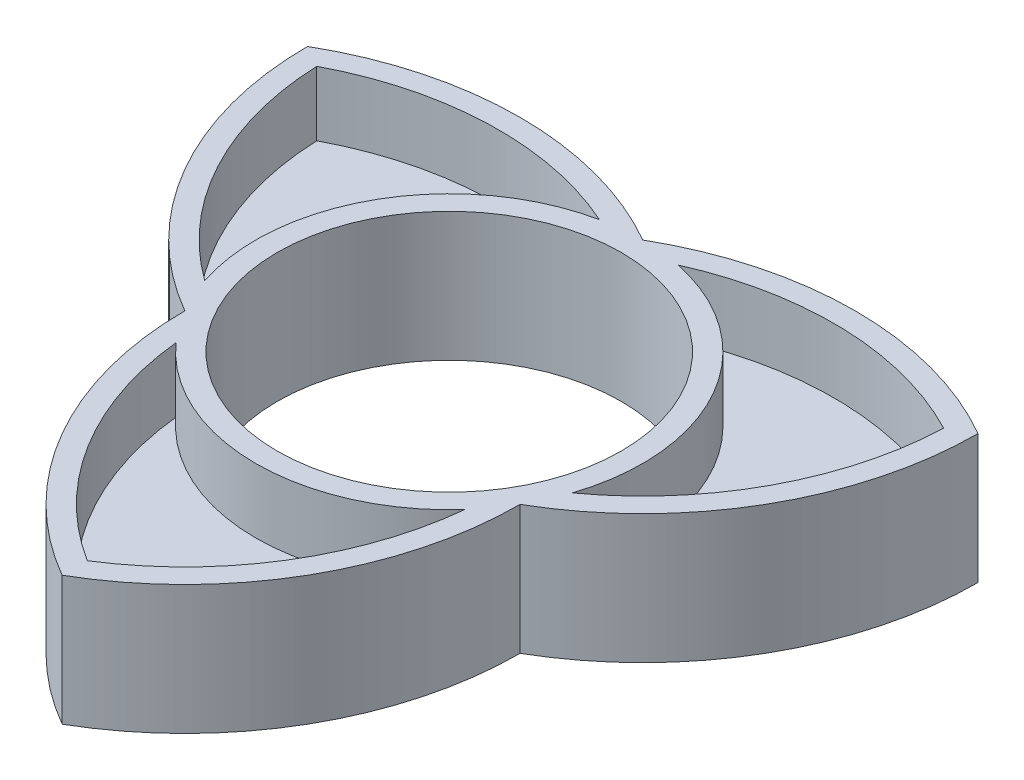
ISO-10303-21;
HEADER;
FILE_DESCRIPTION(('STEP AP214'),'2;1');
FILE_NAME('part.step','',(''),(''),'','','');
FILE_SCHEMA(('AUTOMOTIVE_DESIGN { 1 0 10303 214 1 1 1 1 }'));
ENDSEC;
DATA;
#1=APPLICATION_CONTEXT('core data for automotive mechanical design processes');
#2=APPLICATION_PROTOCOL_DEFINITION('international standard','automotive_design',2000,#1);
#3=PRODUCT_CONTEXT('',#1,'mechanical');
#4=PRODUCT('Part','Part','',(#3));
#5=PRODUCT_RELATED_PRODUCT_CATEGORY('part','',(#4));
#6=PRODUCT_DEFINITION_FORMATION('','',#4);
#7=PRODUCT_DEFINITION_CONTEXT('part definition',#1,'design');
#8=PRODUCT_DEFINITION('design','',#6,#7);
#9=PRODUCT_DEFINITION_SHAPE('','',#8);
#10=(LENGTH_UNIT() NAMED_UNIT(*) SI_UNIT(.MILLI.,.METRE.));
#11=(NAMED_UNIT(*) PLANE_ANGLE_UNIT() SI_UNIT($,.RADIAN.));
#12=(NAMED_UNIT(*) SI_UNIT($,.STERADIAN.) SOLID_ANGLE_UNIT());
#13=UNCERTAINTY_MEASURE_WITH_UNIT(LENGTH_MEASURE(1.E-05),#10,'distance_accuracy_value','');
#14=(GEOMETRIC_REPRESENTATION_CONTEXT(3) GLOBAL_UNCERTAINTY_ASSIGNED_CONTEXT((#13)) GLOBAL_UNIT_ASSIGNED_CONTEXT((#10,
#11,#12)) REPRESENTATION_CONTEXT('',''));
#15=CARTESIAN_POINT('',(0.,0.,0.));
#16=DIRECTION('',(0.,0.,1.));
#17=DIRECTION('',(1.,0.,0.));
#18=AXIS2_PLACEMENT_3D('',#15,#16,#17);
#19=CARTESIAN_POINT('',(-49.6410161513769,-0.01,-37.6602540378446));
#20=DIRECTION('',(0.,1.,0.));
#21=DIRECTION('',(0.,0.,1.));
#22=AXIS2_PLACEMENT_3D('',#19,#20,#21);
#23=CYLINDRICAL_SURFACE('',#22,15.5884572681199);
#24=CARTESIAN_POINT('',(-49.6410161513769,0.,-37.6602540378446));
#25=DIRECTION('',(0.,1.,0.));
#26=DIRECTION('',(0.,0.,1.));
#27=AXIS2_PLACEMENT_3D('',#24,#25,#26);
#28=CIRCLE('',#27,15.5884572681198);
#29=CARTESIAN_POINT('',(-41.8467875173167,0.,-24.1602540378449));
#30=VERTEX_POINT('',#29);
#31=CARTESIAN_POINT('',(-34.052558883257,0.,-37.6602540378446));
#32=VERTEX_POINT('',#31);
#33=EDGE_CURVE('E164',#30,#32,#28,.T.);
#34=ORIENTED_EDGE('',*,*,#33,.T.);
#35=DIRECTION('',(0.,1.,0.));
#36=VECTOR('',#35,1.);
#37=CARTESIAN_POINT('',(-34.0525588832569,-0.01,-37.6602540378446));
#38=LINE('',#37,#36);
#39=CARTESIAN_POINT('',(-34.0525588832569,6.,-37.6602540378446));
#40=VERTEX_POINT('',#39);
#41=EDGE_CURVE('E11',#32,#40,#38,.T.);
#42=ORIENTED_EDGE('',*,*,#41,.T.);
#43=CARTESIAN_POINT('',(-49.6410161513769,6.,-37.6602540378446));
#44=DIRECTION('',(0.,1.,0.));
#45=DIRECTION('',(0.,0.,1.));
#46=AXIS2_PLACEMENT_3D('',#43,#44,#45);
#47=CIRCLE('',#46,15.5884572681198);
#48=CARTESIAN_POINT('',(-41.8467875173169,6.,-24.1602540378451));
#49=VERTEX_POINT('',#48);
#50=EDGE_CURVE('E187',#49,#40,#47,.T.);
#51=ORIENTED_EDGE('',*,*,#50,.F.);
#52=DIRECTION('',(0.,-1.,0.));
#53=VECTOR('',#52,1.);
#54=CARTESIAN_POINT('',(-41.8467875173167,3.,-24.1602540378449));
#55=LINE('',#54,#53);
#56=EDGE_CURVE('E177',#49,#30,#55,.T.);
#57=ORIENTED_EDGE('',*,*,#56,.T.);
#58=EDGE_LOOP('',(#34,#42,#51,#57));
#59=FACE_BOUND('',#58,.T.);
#60=ADVANCED_FACE('F44',(#59),#23,.T.);
#61=CARTESIAN_POINT('',(-41.8467875173169,-0.01,-24.1602540378451));
#62=DIRECTION('',(0.,1.,0.));
#63=DIRECTION('',(0.,0.,1.));
#64=AXIS2_PLACEMENT_3D('',#61,#62,#63);
#65=CYLINDRICAL_SURFACE('',#64,15.5884572681195);
#66=ORIENTED_EDGE('',*,*,#41,.F.);
#67=CARTESIAN_POINT('',(-41.8467875173169,0.,-24.1602540378451));
#68=DIRECTION('',(0.,1.,0.));
#69=DIRECTION('',(0.,0.,1.));
#70=AXIS2_PLACEMENT_3D('',#67,#68,#69);
#71=CIRCLE('',#70,15.5884572681195);
#72=CARTESIAN_POINT('',(-49.6410161513769,0.,-37.6602540378446));
#73=VERTEX_POINT('',#72);
#74=EDGE_CURVE('E161',#73,#32,#71,.F.);
#75=ORIENTED_EDGE('',*,*,#74,.F.);
#76=DIRECTION('',(0.,-1.,0.));
#77=VECTOR('',#76,1.);
#78=CARTESIAN_POINT('',(-49.6410161513769,3.,-37.6602540378446));
#79=LINE('',#78,#77);
#80=CARTESIAN_POINT('',(-49.6410161513769,6.,-37.6602540378447));
#81=VERTEX_POINT('',#80);
#82=EDGE_CURVE('E183',#81,#73,#79,.T.);
#83=ORIENTED_EDGE('',*,*,#82,.F.);
#84=CARTESIAN_POINT('',(-41.8467875173169,6.,-24.1602540378451));
#85=DIRECTION('',(0.,1.,0.));
#86=DIRECTION('',(0.,0.,1.));
#87=AXIS2_PLACEMENT_3D('',#84,#85,#86);
#88=CIRCLE('',#87,15.5884572681195);
#89=EDGE_CURVE('E182',#40,#81,#88,.T.);
#90=ORIENTED_EDGE('',*,*,#89,.F.);
#91=EDGE_LOOP('',(#66,#75,#83,#90));
#92=FACE_BOUND('',#91,.T.);
#93=ADVANCED_FACE('F181',(#92),#65,.T.);
#94=CARTESIAN_POINT('',(0.,3.,0.));
#95=DIRECTION('',(0.,1.,0.));
#96=DIRECTION('',(0.,0.,1.));
#97=AXIS2_PLACEMENT_3D('',#94,#95,#96);
#98=PLANE('',#97);
#99=CARTESIAN_POINT('',(-41.8467875173169,3.,-24.1602540378451));
#100=DIRECTION('',(0.,1.,0.));
#101=DIRECTION('',(0.,0.,1.));
#102=AXIS2_PLACEMENT_3D('',#99,#100,#101);
#103=CIRCLE('',#102,14.5884572681202);
#104=CARTESIAN_POINT('',(-56.3590588345806,3.,-22.6712722790935));
#105=VERTEX_POINT('',#104);
#106=CARTESIAN_POINT('',(-49.6410161513768,3.,-11.8284623811646));
#107=VERTEX_POINT('',#106);
#108=EDGE_CURVE('E124',#105,#107,#103,.T.);
#109=ORIENTED_EDGE('',*,*,#108,.T.);
#110=CARTESIAN_POINT('',(-57.4352447854369,3.,-24.1602540378445));
#111=DIRECTION('',(0.,1.,0.));
#112=DIRECTION('',(0.,0.,1.));
#113=AXIS2_PLACEMENT_3D('',#110,#111,#112);
#114=CIRCLE('',#113,14.58845726812);
#115=CARTESIAN_POINT('',(-42.9229734681733,3.,-22.6712722790941));
#116=VERTEX_POINT('',#115);
#117=EDGE_CURVE('E217',#107,#116,#114,.T.);
#118=ORIENTED_EDGE('',*,*,#117,.T.);
#119=CARTESIAN_POINT('',(-49.6410161513772,3.,-28.660254037845));
#120=DIRECTION('',(0.,1.,0.));
#121=DIRECTION('',(0.,0.,1.));
#122=AXIS2_PLACEMENT_3D('',#119,#120,#121);
#123=CIRCLE('',#122,9.);
#124=EDGE_CURVE('E226',#105,#116,#123,.T.);
#125=ORIENTED_EDGE('',*,*,#124,.F.);
#126=EDGE_LOOP('',(#109,#118,#125));
#127=FACE_BOUND('',#126,.T.);
#128=ADVANCED_FACE('F325',(#127),#98,.T.);
#129=CARTESIAN_POINT('',(-57.4352447854369,3.,-24.1602540378445));
#130=DIRECTION('',(0.,1.,0.));
#131=DIRECTION('',(0.,0.,1.));
#132=AXIS2_PLACEMENT_3D('',#129,#130,#131);
#133=CIRCLE('',#132,14.58845726812);
#134=CARTESIAN_POINT('',(-51.4686051556561,3.,-37.4727405445829));
#135=VERTEX_POINT('',#134);
#136=CARTESIAN_POINT('',(-64.2177753172688,3.,-37.0761498661846));
#137=VERTEX_POINT('',#136);
#138=EDGE_CURVE('E288',#135,#137,#133,.T.);
#139=ORIENTED_EDGE('',*,*,#138,.T.);
#140=CARTESIAN_POINT('',(-49.6410161513769,3.,-37.6602540378446));
#141=DIRECTION('',(0.,1.,0.));
#142=DIRECTION('',(0.,0.,1.));
#143=AXIS2_PLACEMENT_3D('',#140,#141,#142);
#144=CIRCLE('',#143,14.58845726812);
#145=CARTESIAN_POINT('',(-58.1866478388591,3.,-25.8367492898579));
#146=VERTEX_POINT('',#145);
#147=EDGE_CURVE('E286',#137,#146,#144,.T.);
#148=ORIENTED_EDGE('',*,*,#147,.T.);
#149=EDGE_CURVE('E227',#135,#146,#123,.T.);
#150=ORIENTED_EDGE('',*,*,#149,.F.);
#151=EDGE_LOOP('',(#139,#148,#150));
#152=FACE_BOUND('',#151,.T.);
#153=ADVANCED_FACE('F324',(#152),#98,.T.);
#154=CARTESIAN_POINT('',(-49.6410161513769,3.,-37.6602540378446));
#155=DIRECTION('',(0.,1.,0.));
#156=DIRECTION('',(0.,0.,1.));
#157=AXIS2_PLACEMENT_3D('',#154,#155,#156);
#158=CIRCLE('',#157,14.5884572681198);
#159=CARTESIAN_POINT('',(-41.0953844638954,3.,-25.8367492898577));
#160=VERTEX_POINT('',#159);
#161=CARTESIAN_POINT('',(-35.0642569854851,3.,-37.0761498661846));
#162=VERTEX_POINT('',#161);
#163=EDGE_CURVE('E61',#160,#162,#158,.T.);
#164=ORIENTED_EDGE('',*,*,#163,.T.);
#165=CARTESIAN_POINT('',(-41.8467875173169,3.,-24.1602540378451));
#166=DIRECTION('',(0.,1.,0.));
#167=DIRECTION('',(0.,0.,1.));
#168=AXIS2_PLACEMENT_3D('',#165,#166,#167);
#169=CIRCLE('',#168,14.5884572681195);
#170=CARTESIAN_POINT('',(-47.8134271470979,3.,-37.4727405445829));
#171=VERTEX_POINT('',#170);
#172=EDGE_CURVE('E224',#162,#171,#169,.T.);
#173=ORIENTED_EDGE('',*,*,#172,.T.);
#174=EDGE_CURVE('E221',#160,#171,#123,.T.);
#175=ORIENTED_EDGE('',*,*,#174,.F.);
#176=EDGE_LOOP('',(#164,#173,#175));
#177=FACE_BOUND('',#176,.T.);
#178=ADVANCED_FACE('F290',(#177),#98,.T.);
#179=CARTESIAN_POINT('',(-49.6410161513772,6.,-28.660254037845));
#180=DIRECTION('',(0.,-1.,0.));
#181=DIRECTION('',(0.,0.,-1.));
#182=AXIS2_PLACEMENT_3D('',#179,#180,#181);
#183=CYLINDRICAL_SURFACE('',#182,8.);
#184=CARTESIAN_POINT('',(-49.6410161513772,6.,-28.660254037845));
#185=DIRECTION('',(0.,1.,0.));
#186=DIRECTION('',(0.,0.,1.));
#187=AXIS2_PLACEMENT_3D('',#184,#185,#186);
#188=CIRCLE('',#187,8.);
#189=CARTESIAN_POINT('',(-49.6410161513772,6.,-20.660254037845));
#190=VERTEX_POINT('',#189);
#191=EDGE_CURVE('E230',#190,#190,#188,.T.);
#192=ORIENTED_EDGE('',*,*,#191,.T.);
#193=EDGE_LOOP('',(#192));
#194=FACE_BOUND('',#193,.T.);
#195=CARTESIAN_POINT('',(-49.6410161513772,0.,-28.660254037845));
#196=DIRECTION('',(0.,1.,0.));
#197=DIRECTION('',(0.,0.,1.));
#198=AXIS2_PLACEMENT_3D('',#195,#196,#197);
#199=CIRCLE('',#198,8.);
#200=CARTESIAN_POINT('',(-49.6410161513772,0.,-20.660254037845));
#201=VERTEX_POINT('',#200);
#202=EDGE_CURVE('E53',#201,#201,#199,.T.);
#203=ORIENTED_EDGE('',*,*,#202,.F.);
#204=EDGE_LOOP('',(#203));
#205=FACE_BOUND('',#204,.T.);
#206=ADVANCED_FACE('F346',(#194,#205),#183,.F.);
#207=CARTESIAN_POINT('',(-41.8467875173169,3.,-24.1602540378451));
#208=DIRECTION('',(0.,-1.,0.));
#209=DIRECTION('',(0.,0.,-1.));
#210=AXIS2_PLACEMENT_3D('',#207,#208,#209);
#211=CYLINDRICAL_SURFACE('',#210,15.5884572681204);
#212=CARTESIAN_POINT('',(-41.8467875173169,0.,-24.1602540378451));
#213=DIRECTION('',(0.,1.,0.));
#214=DIRECTION('',(0.,0.,1.));
#215=AXIS2_PLACEMENT_3D('',#212,#213,#214);
#216=CIRCLE('',#215,15.5884572681204);
#217=CARTESIAN_POINT('',(-49.6410161513769,0.,-10.6602540378444));
#218=VERTEX_POINT('',#217);
#219=CARTESIAN_POINT('',(-57.4352447854369,0.,-24.1602540378445));
#220=VERTEX_POINT('',#219);
#221=EDGE_CURVE('E250',#218,#220,#216,.F.);
#222=ORIENTED_EDGE('',*,*,#221,.F.);
#223=DIRECTION('',(0.,-1.,0.));
#224=VECTOR('',#223,1.);
#225=CARTESIAN_POINT('',(-49.6410161513769,3.,-10.6602540378444));
#226=LINE('',#225,#224);
#227=CARTESIAN_POINT('',(-49.6410161513769,6.,-10.6602540378444));
#228=VERTEX_POINT('',#227);
#229=EDGE_CURVE('E248',#228,#218,#226,.T.);
#230=ORIENTED_EDGE('',*,*,#229,.F.);
#231=CARTESIAN_POINT('',(-41.8467875173169,6.,-24.1602540378451));
#232=DIRECTION('',(0.,1.,0.));
#233=DIRECTION('',(0.,0.,1.));
#234=AXIS2_PLACEMENT_3D('',#231,#232,#233);
#235=CIRCLE('',#234,15.5884572681202);
#236=CARTESIAN_POINT('',(-57.4352447854371,6.,-24.1602540378445));
#237=VERTEX_POINT('',#236);
#238=EDGE_CURVE('E233',#237,#228,#235,.T.);
#239=ORIENTED_EDGE('',*,*,#238,.F.);
#240=DIRECTION('',(0.,-1.,0.));
#241=VECTOR('',#240,1.);
#242=CARTESIAN_POINT('',(-57.4352447854369,3.,-24.1602540378445));
#243=LINE('',#242,#241);
#244=EDGE_CURVE('E246',#237,#220,#243,.T.);
#245=ORIENTED_EDGE('',*,*,#244,.T.);
#246=EDGE_LOOP('',(#222,#230,#239,#245));
#247=FACE_BOUND('',#246,.T.);
#248=ADVANCED_FACE('F245',(#247),#211,.T.);
#249=CARTESIAN_POINT('',(-49.6410161513769,3.,-37.6602540378446));
#250=DIRECTION('',(0.,-1.,0.));
#251=DIRECTION('',(0.,0.,-1.));
#252=AXIS2_PLACEMENT_3D('',#249,#250,#251);
#253=CYLINDRICAL_SURFACE('',#252,15.58845726812);
#254=CARTESIAN_POINT('',(-49.6410161513769,0.,-37.6602540378446));
#255=DIRECTION('',(0.,1.,0.));
#256=DIRECTION('',(0.,0.,1.));
#257=AXIS2_PLACEMENT_3D('',#254,#255,#256);
#258=CIRCLE('',#257,15.58845726812);
#259=CARTESIAN_POINT('',(-65.2294734194969,0.,-37.6602540378446));
#260=VERTEX_POINT('',#259);
#261=EDGE_CURVE('E260',#260,#220,#258,.T.);
#262=ORIENTED_EDGE('',*,*,#261,.T.);
#263=ORIENTED_EDGE('',*,*,#244,.F.);
#264=CARTESIAN_POINT('',(-49.6410161513769,6.,-37.6602540378446));
#265=DIRECTION('',(0.,1.,0.));
#266=DIRECTION('',(0.,0.,1.));
#267=AXIS2_PLACEMENT_3D('',#264,#265,#266);
#268=CIRCLE('',#267,15.58845726812);
#269=CARTESIAN_POINT('',(-65.2294734194969,6.,-37.6602540378446));
#270=VERTEX_POINT('',#269);
#271=EDGE_CURVE('E192',#270,#237,#268,.T.);
#272=ORIENTED_EDGE('',*,*,#271,.F.);
#273=DIRECTION('',(0.,-1.,0.));
#274=VECTOR('',#273,1.);
#275=CARTESIAN_POINT('',(-65.2294734194969,3.,-37.6602540378446));
#276=LINE('',#275,#274);
#277=EDGE_CURVE('E254',#270,#260,#276,.T.);
#278=ORIENTED_EDGE('',*,*,#277,.T.);
#279=EDGE_LOOP('',(#262,#263,#272,#278));
#280=FACE_BOUND('',#279,.T.);
#281=ADVANCED_FACE('F354',(#280),#253,.T.);
#282=CARTESIAN_POINT('',(-57.4352447854369,3.,-24.1602540378445));
#283=DIRECTION('',(0.,-1.,0.));
#284=DIRECTION('',(0.,0.,-1.));
#285=AXIS2_PLACEMENT_3D('',#282,#283,#284);
#286=CYLINDRICAL_SURFACE('',#285,15.58845726812);
#287=CARTESIAN_POINT('',(-57.4352447854369,0.,-24.1602540378445));
#288=DIRECTION('',(0.,1.,0.));
#289=DIRECTION('',(0.,0.,1.));
#290=AXIS2_PLACEMENT_3D('',#287,#288,#289);
#291=CIRCLE('',#290,15.58845726812);
#292=EDGE_CURVE('E168',#260,#73,#291,.F.);
#293=ORIENTED_EDGE('',*,*,#292,.F.);
#294=ORIENTED_EDGE('',*,*,#277,.F.);
#295=CARTESIAN_POINT('',(-57.4352447854369,6.,-24.1602540378445));
#296=DIRECTION('',(0.,1.,0.));
#297=DIRECTION('',(0.,0.,1.));
#298=AXIS2_PLACEMENT_3D('',#295,#296,#297);
#299=CIRCLE('',#298,15.58845726812);
#300=EDGE_CURVE('E188',#81,#270,#299,.T.);
#301=ORIENTED_EDGE('',*,*,#300,.F.);
#302=ORIENTED_EDGE('',*,*,#82,.T.);
#303=EDGE_LOOP('',(#293,#294,#301,#302));
#304=FACE_BOUND('',#303,.T.);
#305=ADVANCED_FACE('F336',(#304),#286,.T.);
#306=CARTESIAN_POINT('',(-57.4352447854369,3.,-24.1602540378445));
#307=DIRECTION('',(0.,-1.,0.));
#308=DIRECTION('',(0.,0.,-1.));
#309=AXIS2_PLACEMENT_3D('',#306,#307,#308);
#310=CYLINDRICAL_SURFACE('',#309,15.58845726812);
#311=CARTESIAN_POINT('',(-57.4352447854369,0.,-24.1602540378445));
#312=DIRECTION('',(0.,1.,0.));
#313=DIRECTION('',(0.,0.,1.));
#314=AXIS2_PLACEMENT_3D('',#311,#312,#313);
#315=CIRCLE('',#314,15.58845726812);
#316=EDGE_CURVE('E178',#30,#218,#315,.F.);
#317=ORIENTED_EDGE('',*,*,#316,.F.);
#318=ORIENTED_EDGE('',*,*,#56,.F.);
#319=CARTESIAN_POINT('',(-57.4352447854369,6.,-24.1602540378445));
#320=DIRECTION('',(0.,1.,0.));
#321=DIRECTION('',(0.,0.,1.));
#322=AXIS2_PLACEMENT_3D('',#319,#320,#321);
#323=CIRCLE('',#322,15.58845726812);
#324=EDGE_CURVE('E190',#228,#49,#323,.T.);
#325=ORIENTED_EDGE('',*,*,#324,.F.);
#326=ORIENTED_EDGE('',*,*,#229,.T.);
#327=EDGE_LOOP('',(#317,#318,#325,#326));
#328=FACE_BOUND('',#327,.T.);
#329=ADVANCED_FACE('F329',(#328),#310,.T.);
#330=CARTESIAN_POINT('',(-57.4352447854369,6.,-24.1602540378445));
#331=DIRECTION('',(0.,-1.,0.));
#332=DIRECTION('',(0.,0.,-1.));
#333=AXIS2_PLACEMENT_3D('',#330,#331,#332);
#334=CYLINDRICAL_SURFACE('',#333,14.58845726812);
#335=ORIENTED_EDGE('',*,*,#117,.F.);
#336=DIRECTION('',(0.,-1.,0.));
#337=VECTOR('',#336,1.);
#338=CARTESIAN_POINT('',(-49.6410161513768,6.,-11.8284623811646));
#339=LINE('',#338,#337);
#340=CARTESIAN_POINT('',(-49.6410161513768,6.,-11.8284623811646));
#341=VERTEX_POINT('',#340);
#342=EDGE_CURVE('E273',#341,#107,#339,.T.);
#343=ORIENTED_EDGE('',*,*,#342,.F.);
#344=CARTESIAN_POINT('',(-57.4352447854369,6.,-24.1602540378445));
#345=DIRECTION('',(0.,1.,0.));
#346=DIRECTION('',(0.,0.,1.));
#347=AXIS2_PLACEMENT_3D('',#344,#345,#346);
#348=CIRCLE('',#347,14.58845726812);
#349=CARTESIAN_POINT('',(-42.9229734681733,6.,-22.6712722790941));
#350=VERTEX_POINT('',#349);
#351=EDGE_CURVE('E198',#341,#350,#348,.T.);
#352=ORIENTED_EDGE('',*,*,#351,.T.);
#353=DIRECTION('',(0.,-1.,0.));
#354=VECTOR('',#353,1.);
#355=CARTESIAN_POINT('',(-42.9229734681733,6.,-22.6712722790941));
#356=LINE('',#355,#354);
#357=EDGE_CURVE('E280',#350,#116,#356,.T.);
#358=ORIENTED_EDGE('',*,*,#357,.T.);
#359=EDGE_LOOP('',(#335,#343,#352,#358));
#360=FACE_BOUND('',#359,.T.);
#361=ADVANCED_FACE('F327',(#360),#334,.F.);
#362=CARTESIAN_POINT('',(-49.6410161513772,6.,-28.660254037845));
#363=DIRECTION('',(0.,-1.,0.));
#364=DIRECTION('',(0.,0.,-1.));
#365=AXIS2_PLACEMENT_3D('',#362,#363,#364);
#366=CYLINDRICAL_SURFACE('',#365,9.);
#367=ORIENTED_EDGE('',*,*,#124,.T.);
#368=ORIENTED_EDGE('',*,*,#357,.F.);
#369=CARTESIAN_POINT('',(-49.6410161513772,6.,-28.660254037845));
#370=DIRECTION('',(0.,1.,0.));
#371=DIRECTION('',(0.,0.,1.));
#372=AXIS2_PLACEMENT_3D('',#369,#370,#371);
#373=CIRCLE('',#372,9.);
#374=CARTESIAN_POINT('',(-56.3590588345806,6.,-22.6712722790935));
#375=VERTEX_POINT('',#374);
#376=EDGE_CURVE('E201',#375,#350,#373,.T.);
#377=ORIENTED_EDGE('',*,*,#376,.F.);
#378=DIRECTION('',(0.,-1.,0.));
#379=VECTOR('',#378,1.);
#380=CARTESIAN_POINT('',(-56.3590588345806,6.,-22.6712722790935));
#381=LINE('',#380,#379);
#382=EDGE_CURVE('E172',#375,#105,#381,.T.);
#383=ORIENTED_EDGE('',*,*,#382,.T.);
#384=EDGE_LOOP('',(#367,#368,#377,#383));
#385=FACE_BOUND('',#384,.T.);
#386=ADVANCED_FACE('F311',(#385),#366,.T.);
#387=CARTESIAN_POINT('',(-41.8467875173169,6.,-24.1602540378451));
#388=DIRECTION('',(0.,-1.,0.));
#389=DIRECTION('',(0.,0.,-1.));
#390=AXIS2_PLACEMENT_3D('',#387,#388,#389);
#391=CYLINDRICAL_SURFACE('',#390,14.5884572681202);
#392=ORIENTED_EDGE('',*,*,#108,.F.);
#393=ORIENTED_EDGE('',*,*,#382,.F.);
#394=CARTESIAN_POINT('',(-41.8467875173169,6.,-24.1602540378451));
#395=DIRECTION('',(0.,1.,0.));
#396=DIRECTION('',(0.,0.,1.));
#397=AXIS2_PLACEMENT_3D('',#394,#395,#396);
#398=CIRCLE('',#397,14.5884572681202);
#399=EDGE_CURVE('E202',#375,#341,#398,.T.);
#400=ORIENTED_EDGE('',*,*,#399,.T.);
#401=ORIENTED_EDGE('',*,*,#342,.T.);
#402=EDGE_LOOP('',(#392,#393,#400,#401));
#403=FACE_BOUND('',#402,.T.);
#404=ADVANCED_FACE('F307',(#403),#391,.F.);
#405=CARTESIAN_POINT('',(-49.6410161513769,6.,-37.6602540378446));
#406=DIRECTION('',(0.,-1.,0.));
#407=DIRECTION('',(0.,0.,-1.));
#408=AXIS2_PLACEMENT_3D('',#405,#406,#407);
#409=CYLINDRICAL_SURFACE('',#408,14.58845726812);
#410=ORIENTED_EDGE('',*,*,#147,.F.);
#411=DIRECTION('',(0.,-1.,0.));
#412=VECTOR('',#411,1.);
#413=CARTESIAN_POINT('',(-64.2177753172688,6.,-37.0761498661846));
#414=LINE('',#413,#412);
#415=CARTESIAN_POINT('',(-64.2177753172688,6.,-37.0761498661846));
#416=VERTEX_POINT('',#415);
#417=EDGE_CURVE('E265',#416,#137,#414,.T.);
#418=ORIENTED_EDGE('',*,*,#417,.F.);
#419=CARTESIAN_POINT('',(-49.6410161513769,6.,-37.6602540378446));
#420=DIRECTION('',(0.,1.,0.));
#421=DIRECTION('',(0.,0.,1.));
#422=AXIS2_PLACEMENT_3D('',#419,#420,#421);
#423=CIRCLE('',#422,14.58845726812);
#424=CARTESIAN_POINT('',(-58.1866478388591,6.,-25.8367492898579));
#425=VERTEX_POINT('',#424);
#426=EDGE_CURVE('E205',#416,#425,#423,.T.);
#427=ORIENTED_EDGE('',*,*,#426,.T.);
#428=DIRECTION('',(0.,-1.,0.));
#429=VECTOR('',#428,1.);
#430=CARTESIAN_POINT('',(-58.1866478388591,6.,-25.8367492898579));
#431=LINE('',#430,#429);
#432=EDGE_CURVE('E272',#425,#146,#431,.T.);
#433=ORIENTED_EDGE('',*,*,#432,.T.);
#434=EDGE_LOOP('',(#410,#418,#427,#433));
#435=FACE_BOUND('',#434,.T.);
#436=ADVANCED_FACE('F319',(#435),#409,.F.);
#437=ORIENTED_EDGE('',*,*,#149,.T.);
#438=ORIENTED_EDGE('',*,*,#432,.F.);
#439=CARTESIAN_POINT('',(-51.4686051556561,6.,-37.4727405445829));
#440=VERTEX_POINT('',#439);
#441=EDGE_CURVE('E208',#440,#425,#373,.T.);
#442=ORIENTED_EDGE('',*,*,#441,.F.);
#443=DIRECTION('',(0.,-1.,0.));
#444=VECTOR('',#443,1.);
#445=CARTESIAN_POINT('',(-51.4686051556561,6.,-37.4727405445829));
#446=LINE('',#445,#444);
#447=EDGE_CURVE('E269',#440,#135,#446,.T.);
#448=ORIENTED_EDGE('',*,*,#447,.T.);
#449=EDGE_LOOP('',(#437,#438,#442,#448));
#450=FACE_BOUND('',#449,.T.);
#451=ADVANCED_FACE('F316',(#450),#366,.T.);
#452=CARTESIAN_POINT('',(-57.4352447854369,6.,-24.1602540378445));
#453=DIRECTION('',(0.,-1.,0.));
#454=DIRECTION('',(0.,0.,-1.));
#455=AXIS2_PLACEMENT_3D('',#452,#453,#454);
#456=CYLINDRICAL_SURFACE('',#455,14.58845726812);
#457=ORIENTED_EDGE('',*,*,#138,.F.);
#458=ORIENTED_EDGE('',*,*,#447,.F.);
#459=CARTESIAN_POINT('',(-57.4352447854369,6.,-24.1602540378445));
#460=DIRECTION('',(0.,1.,0.));
#461=DIRECTION('',(0.,0.,1.));
#462=AXIS2_PLACEMENT_3D('',#459,#460,#461);
#463=CIRCLE('',#462,14.58845726812);
#464=EDGE_CURVE('E209',#440,#416,#463,.T.);
#465=ORIENTED_EDGE('',*,*,#464,.T.);
#466=ORIENTED_EDGE('',*,*,#417,.T.);
#467=EDGE_LOOP('',(#457,#458,#465,#466));
#468=FACE_BOUND('',#467,.T.);
#469=ADVANCED_FACE('F322',(#468),#456,.F.);
#470=CARTESIAN_POINT('',(-41.8467875173169,6.,-24.1602540378451));
#471=DIRECTION('',(0.,-1.,0.));
#472=DIRECTION('',(0.,0.,-1.));
#473=AXIS2_PLACEMENT_3D('',#470,#471,#472);
#474=CYLINDRICAL_SURFACE('',#473,14.5884572681195);
#475=ORIENTED_EDGE('',*,*,#172,.F.);
#476=DIRECTION('',(0.,-1.,0.));
#477=VECTOR('',#476,1.);
#478=CARTESIAN_POINT('',(-35.0642569854851,6.,-37.0761498661846));
#479=LINE('',#478,#477);
#480=CARTESIAN_POINT('',(-35.0642569854851,6.,-37.0761498661846));
#481=VERTEX_POINT('',#480);
#482=EDGE_CURVE('E234',#481,#162,#479,.T.);
#483=ORIENTED_EDGE('',*,*,#482,.F.);
#484=CARTESIAN_POINT('',(-41.8467875173169,6.,-24.1602540378451));
#485=DIRECTION('',(0.,1.,0.));
#486=DIRECTION('',(0.,0.,1.));
#487=AXIS2_PLACEMENT_3D('',#484,#485,#486);
#488=CIRCLE('',#487,14.5884572681195);
#489=CARTESIAN_POINT('',(-47.8134271470979,6.,-37.4727405445829));
#490=VERTEX_POINT('',#489);
#491=EDGE_CURVE('E212',#481,#490,#488,.T.);
#492=ORIENTED_EDGE('',*,*,#491,.T.);
#493=DIRECTION('',(0.,-1.,0.));
#494=VECTOR('',#493,1.);
#495=CARTESIAN_POINT('',(-47.8134271470979,6.,-37.4727405445829));
#496=LINE('',#495,#494);
#497=EDGE_CURVE('E264',#490,#171,#496,.T.);
#498=ORIENTED_EDGE('',*,*,#497,.T.);
#499=EDGE_LOOP('',(#475,#483,#492,#498));
#500=FACE_BOUND('',#499,.T.);
#501=ADVANCED_FACE('F292',(#500),#474,.F.);
#502=ORIENTED_EDGE('',*,*,#174,.T.);
#503=ORIENTED_EDGE('',*,*,#497,.F.);
#504=CARTESIAN_POINT('',(-41.0953844638954,6.,-25.8367492898577));
#505=VERTEX_POINT('',#504);
#506=EDGE_CURVE('E112',#505,#490,#373,.T.);
#507=ORIENTED_EDGE('',*,*,#506,.F.);
#508=DIRECTION('',(0.,-1.,0.));
#509=VECTOR('',#508,1.);
#510=CARTESIAN_POINT('',(-41.0953844638954,6.,-25.8367492898577));
#511=LINE('',#510,#509);
#512=EDGE_CURVE('E118',#505,#160,#511,.T.);
#513=ORIENTED_EDGE('',*,*,#512,.T.);
#514=EDGE_LOOP('',(#502,#503,#507,#513));
#515=FACE_BOUND('',#514,.T.);
#516=ADVANCED_FACE('F294',(#515),#366,.T.);
#517=CARTESIAN_POINT('',(-49.6410161513769,6.,-37.6602540378446));
#518=DIRECTION('',(0.,-1.,0.));
#519=DIRECTION('',(0.,0.,-1.));
#520=AXIS2_PLACEMENT_3D('',#517,#518,#519);
#521=CYLINDRICAL_SURFACE('',#520,14.5884572681198);
#522=ORIENTED_EDGE('',*,*,#163,.F.);
#523=ORIENTED_EDGE('',*,*,#512,.F.);
#524=CARTESIAN_POINT('',(-49.6410161513769,6.,-37.6602540378446));
#525=DIRECTION('',(0.,1.,0.));
#526=DIRECTION('',(0.,0.,1.));
#527=AXIS2_PLACEMENT_3D('',#524,#525,#526);
#528=CIRCLE('',#527,14.5884572681198);
#529=EDGE_CURVE('E216',#505,#481,#528,.T.);
#530=ORIENTED_EDGE('',*,*,#529,.T.);
#531=ORIENTED_EDGE('',*,*,#482,.T.);
#532=EDGE_LOOP('',(#522,#523,#530,#531));
#533=FACE_BOUND('',#532,.T.);
#534=ADVANCED_FACE('F295',(#533),#521,.F.);
#535=CARTESIAN_POINT('',(0.,6.,0.));
#536=DIRECTION('',(0.,1.,0.));
#537=DIRECTION('',(0.,0.,1.));
#538=AXIS2_PLACEMENT_3D('',#535,#536,#537);
#539=PLANE('',#538);
#540=ORIENTED_EDGE('',*,*,#529,.F.);
#541=ORIENTED_EDGE('',*,*,#506,.T.);
#542=ORIENTED_EDGE('',*,*,#491,.F.);
#543=EDGE_LOOP('',(#540,#541,#542));
#544=FACE_BOUND('',#543,.T.);
#545=ORIENTED_EDGE('',*,*,#464,.F.);
#546=ORIENTED_EDGE('',*,*,#441,.T.);
#547=ORIENTED_EDGE('',*,*,#426,.F.);
#548=EDGE_LOOP('',(#545,#546,#547));
#549=FACE_BOUND('',#548,.T.);
#550=ORIENTED_EDGE('',*,*,#399,.F.);
#551=ORIENTED_EDGE('',*,*,#376,.T.);
#552=ORIENTED_EDGE('',*,*,#351,.F.);
#553=EDGE_LOOP('',(#550,#551,#552));
#554=FACE_BOUND('',#553,.T.);
#555=ORIENTED_EDGE('',*,*,#324,.T.);
#556=ORIENTED_EDGE('',*,*,#50,.T.);
#557=ORIENTED_EDGE('',*,*,#89,.T.);
#558=ORIENTED_EDGE('',*,*,#300,.T.);
#559=ORIENTED_EDGE('',*,*,#271,.T.);
#560=ORIENTED_EDGE('',*,*,#238,.T.);
#561=EDGE_LOOP('',(#555,#556,#557,#558,#559,#560));
#562=FACE_BOUND('',#561,.T.);
#563=ORIENTED_EDGE('',*,*,#191,.F.);
#564=EDGE_LOOP('',(#563));
#565=FACE_BOUND('',#564,.T.);
#566=ADVANCED_FACE('F239',(#544,#549,#554,#562,#565),#539,.T.);
#567=CARTESIAN_POINT('',(0.,0.,0.));
#568=DIRECTION('',(0.,1.,0.));
#569=DIRECTION('',(0.,0.,1.));
#570=AXIS2_PLACEMENT_3D('',#567,#568,#569);
#571=PLANE('',#570);
#572=ORIENTED_EDGE('',*,*,#202,.T.);
#573=EDGE_LOOP('',(#572));
#574=FACE_BOUND('',#573,.T.);
#575=ORIENTED_EDGE('',*,*,#74,.T.);
#576=ORIENTED_EDGE('',*,*,#33,.F.);
#577=ORIENTED_EDGE('',*,*,#316,.T.);
#578=ORIENTED_EDGE('',*,*,#221,.T.);
#579=ORIENTED_EDGE('',*,*,#261,.F.);
#580=ORIENTED_EDGE('',*,*,#292,.T.);
#581=EDGE_LOOP('',(#575,#576,#577,#578,#579,#580));
#582=FACE_BOUND('',#581,.T.);
#583=ADVANCED_FACE('F46',(#574,#582),#571,.F.);
#584=CLOSED_SHELL('',(#60,#93,#128,#153,#178,#206,#248,#281,#305,#329,#361,#386,#404,#436,#451,
#469,#501,#516,#534,#566,#583));
#585=MANIFOLD_SOLID_BREP('B2',#584);
#586=ADVANCED_BREP_SHAPE_REPRESENTATION('',(#18,#585),#14);
#587=SHAPE_DEFINITION_REPRESENTATION(#9,#586);
ENDSEC;
END-ISO-10303-21;
